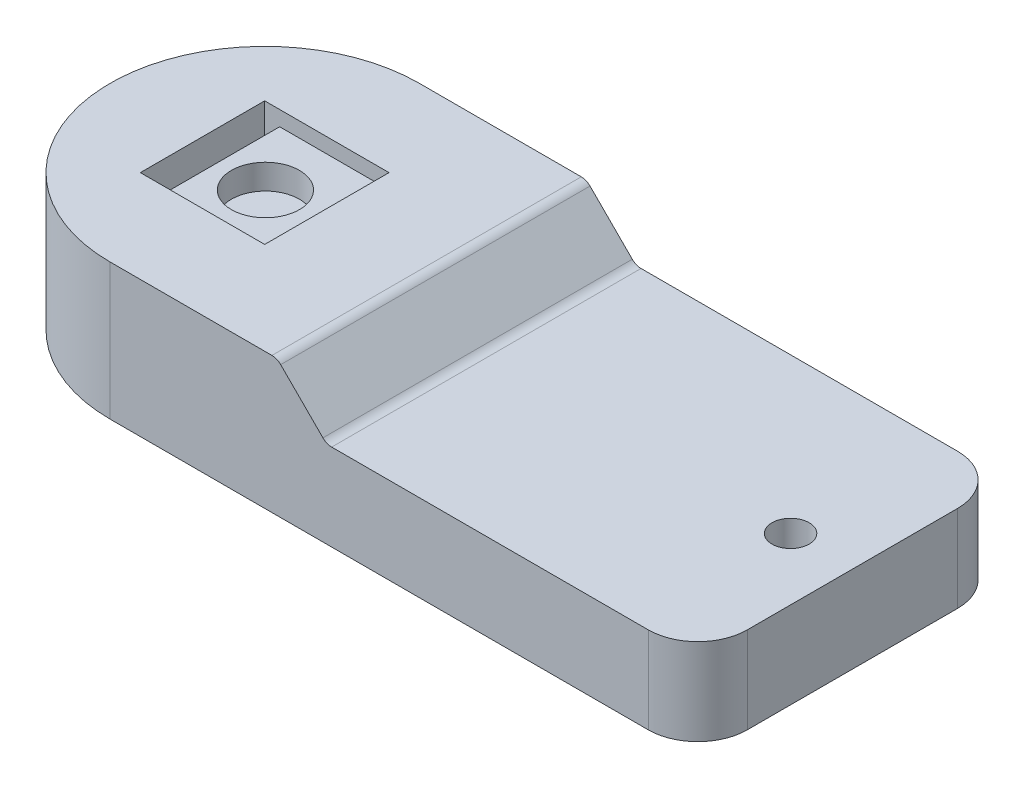
ISO-10303-21;
HEADER;
FILE_DESCRIPTION(('STEP AP214'),'2;1');
FILE_NAME('part.step','',(''),(''),'','','');
FILE_SCHEMA(('AUTOMOTIVE_DESIGN { 1 0 10303 214 1 1 1 1 }'));
ENDSEC;
DATA;
#1=APPLICATION_CONTEXT('core data for automotive mechanical design processes');
#2=APPLICATION_PROTOCOL_DEFINITION('international standard','automotive_design',2000,#1);
#3=PRODUCT_CONTEXT('',#1,'mechanical');
#4=PRODUCT('Part','Part','',(#3));
#5=PRODUCT_RELATED_PRODUCT_CATEGORY('part','',(#4));
#6=PRODUCT_DEFINITION_FORMATION('','',#4);
#7=PRODUCT_DEFINITION_CONTEXT('part definition',#1,'design');
#8=PRODUCT_DEFINITION('design','',#6,#7);
#9=PRODUCT_DEFINITION_SHAPE('','',#8);
#10=(LENGTH_UNIT() NAMED_UNIT(*) SI_UNIT(.MILLI.,.METRE.));
#11=(NAMED_UNIT(*) PLANE_ANGLE_UNIT() SI_UNIT($,.RADIAN.));
#12=(NAMED_UNIT(*) SI_UNIT($,.STERADIAN.) SOLID_ANGLE_UNIT());
#13=UNCERTAINTY_MEASURE_WITH_UNIT(LENGTH_MEASURE(1.E-05),#10,'distance_accuracy_value','');
#14=(GEOMETRIC_REPRESENTATION_CONTEXT(3) GLOBAL_UNCERTAINTY_ASSIGNED_CONTEXT((#13)) GLOBAL_UNIT_ASSIGNED_CONTEXT((#10,
#11,#12)) REPRESENTATION_CONTEXT('',''));
#15=CARTESIAN_POINT('',(0.,0.,0.));
#16=DIRECTION('',(0.,0.,1.));
#17=DIRECTION('',(1.,0.,0.));
#18=AXIS2_PLACEMENT_3D('',#15,#16,#17);
#19=CARTESIAN_POINT('',(-17.5,11.,0.));
#20=DIRECTION('',(0.,-1.,0.));
#21=DIRECTION('',(0.,0.,-1.));
#22=AXIS2_PLACEMENT_3D('',#19,#20,#21);
#23=CYLINDRICAL_SURFACE('',#22,12.5);
#24=DIRECTION('',(0.,-1.,0.));
#25=VECTOR('',#24,1.);
#26=CARTESIAN_POINT('',(-17.5,11.,12.5));
#27=LINE('',#26,#25);
#28=CARTESIAN_POINT('',(-17.5,11.,12.5));
#29=VERTEX_POINT('',#28);
#30=CARTESIAN_POINT('',(-17.5,0.,12.5));
#31=VERTEX_POINT('',#30);
#32=EDGE_CURVE('E252',#29,#31,#27,.T.);
#33=ORIENTED_EDGE('',*,*,#32,.F.);
#34=CARTESIAN_POINT('',(-17.5,11.,0.));
#35=DIRECTION('',(0.,1.,0.));
#36=DIRECTION('',(0.,0.,1.));
#37=AXIS2_PLACEMENT_3D('',#34,#35,#36);
#38=CIRCLE('',#37,12.5);
#39=CARTESIAN_POINT('',(-17.5,11.,-12.5));
#40=VERTEX_POINT('',#39);
#41=EDGE_CURVE('E262',#40,#29,#38,.T.);
#42=ORIENTED_EDGE('',*,*,#41,.F.);
#43=DIRECTION('',(0.,-1.,0.));
#44=VECTOR('',#43,1.);
#45=CARTESIAN_POINT('',(-17.5,11.,-12.5));
#46=LINE('',#45,#44);
#47=CARTESIAN_POINT('',(-17.5,0.,-12.5));
#48=VERTEX_POINT('',#47);
#49=EDGE_CURVE('E259',#48,#40,#46,.F.);
#50=ORIENTED_EDGE('',*,*,#49,.F.);
#51=CARTESIAN_POINT('',(-17.5,0.,0.));
#52=DIRECTION('',(0.,1.,0.));
#53=DIRECTION('',(0.,0.,1.));
#54=AXIS2_PLACEMENT_3D('',#51,#52,#53);
#55=CIRCLE('',#54,12.5);
#56=EDGE_CURVE('E264',#31,#48,#55,.F.);
#57=ORIENTED_EDGE('',*,*,#56,.F.);
#58=EDGE_LOOP('',(#33,#42,#50,#57));
#59=FACE_BOUND('',#58,.T.);
#60=ADVANCED_FACE('F34',(#59),#23,.T.);
#61=CARTESIAN_POINT('',(30.,11.,-12.5));
#62=DIRECTION('',(-1.,0.,0.));
#63=DIRECTION('',(0.,0.,1.));
#64=AXIS2_PLACEMENT_3D('',#61,#62,#63);
#65=PLANE('',#64);
#66=DIRECTION('',(0.,0.,-1.));
#67=VECTOR('',#66,1.);
#68=CARTESIAN_POINT('',(30.,0.,-12.5));
#69=LINE('',#68,#67);
#70=CARTESIAN_POINT('',(30.,0.,8.5));
#71=VERTEX_POINT('',#70);
#72=CARTESIAN_POINT('',(30.,0.,-8.5));
#73=VERTEX_POINT('',#72);
#74=EDGE_CURVE('E254',#71,#73,#69,.T.);
#75=ORIENTED_EDGE('',*,*,#74,.T.);
#76=DIRECTION('',(0.,-1.,0.));
#77=VECTOR('',#76,1.);
#78=CARTESIAN_POINT('',(30.,11.,-8.5));
#79=LINE('',#78,#77);
#80=CARTESIAN_POINT('',(30.,7.,-8.5));
#81=VERTEX_POINT('',#80);
#82=EDGE_CURVE('E55',#73,#81,#79,.F.);
#83=ORIENTED_EDGE('',*,*,#82,.T.);
#84=DIRECTION('',(0.,0.,-1.));
#85=VECTOR('',#84,1.);
#86=CARTESIAN_POINT('',(30.,7.,12.5));
#87=LINE('',#86,#85);
#88=CARTESIAN_POINT('',(30.,7.,8.5));
#89=VERTEX_POINT('',#88);
#90=EDGE_CURVE('E241',#89,#81,#87,.T.);
#91=ORIENTED_EDGE('',*,*,#90,.F.);
#92=DIRECTION('',(0.,-1.,0.));
#93=VECTOR('',#92,1.);
#94=CARTESIAN_POINT('',(30.,11.,8.5));
#95=LINE('',#94,#93);
#96=EDGE_CURVE('E299',#89,#71,#95,.T.);
#97=ORIENTED_EDGE('',*,*,#96,.T.);
#98=EDGE_LOOP('',(#75,#83,#91,#97));
#99=FACE_BOUND('',#98,.T.);
#100=ADVANCED_FACE('F319',(#99),#65,.F.);
#101=CARTESIAN_POINT('',(-30.,11.,12.5));
#102=DIRECTION('',(0.,0.,-1.));
#103=DIRECTION('',(-1.,0.,0.));
#104=AXIS2_PLACEMENT_3D('',#101,#102,#103);
#105=PLANE('',#104);
#106=DIRECTION('',(1.,0.,0.));
#107=VECTOR('',#106,1.);
#108=CARTESIAN_POINT('',(-30.,0.,12.5));
#109=LINE('',#108,#107);
#110=CARTESIAN_POINT('',(26.,0.,12.5));
#111=VERTEX_POINT('',#110);
#112=EDGE_CURVE('E245',#31,#111,#109,.T.);
#113=ORIENTED_EDGE('',*,*,#112,.T.);
#114=DIRECTION('',(0.,-1.,0.));
#115=VECTOR('',#114,1.);
#116=CARTESIAN_POINT('',(26.,11.,12.5));
#117=LINE('',#116,#115);
#118=CARTESIAN_POINT('',(26.,7.,12.5));
#119=VERTEX_POINT('',#118);
#120=EDGE_CURVE('E11',#111,#119,#117,.F.);
#121=ORIENTED_EDGE('',*,*,#120,.T.);
#122=DIRECTION('',(1.,0.,0.));
#123=VECTOR('',#122,1.);
#124=CARTESIAN_POINT('',(0.,7.,12.5));
#125=LINE('',#124,#123);
#126=CARTESIAN_POINT('',(0.41421356237307,7.,12.5));
#127=VERTEX_POINT('',#126);
#128=EDGE_CURVE('E233',#127,#119,#125,.T.);
#129=ORIENTED_EDGE('',*,*,#128,.F.);
#130=CARTESIAN_POINT('',(0.41421356237307,8.,12.5));
#131=DIRECTION('',(0.,0.,-1.));
#132=DIRECTION('',(-1.,0.,0.));
#133=AXIS2_PLACEMENT_3D('',#130,#131,#132);
#134=CIRCLE('',#133,1.);
#135=CARTESIAN_POINT('',(-0.292893218813478,7.29289321881345,12.5));
#136=VERTEX_POINT('',#135);
#137=EDGE_CURVE('E287',#127,#136,#134,.T.);
#138=ORIENTED_EDGE('',*,*,#137,.T.);
#139=DIRECTION('',(-0.707106781186548,0.707106781186548,0.));
#140=VECTOR('',#139,1.);
#141=CARTESIAN_POINT('',(0.,6.99999999999998,12.5));
#142=LINE('',#141,#140);
#143=CARTESIAN_POINT('',(-3.70710678118657,10.7071067811865,12.5));
#144=VERTEX_POINT('',#143);
#145=EDGE_CURVE('E267',#136,#144,#142,.T.);
#146=ORIENTED_EDGE('',*,*,#145,.T.);
#147=CARTESIAN_POINT('',(-4.41421356237312,10.,12.5));
#148=DIRECTION('',(0.,0.,-1.));
#149=DIRECTION('',(-1.,0.,0.));
#150=AXIS2_PLACEMENT_3D('',#147,#148,#149);
#151=CIRCLE('',#150,1.);
#152=CARTESIAN_POINT('',(-4.41421356237312,11.,12.5));
#153=VERTEX_POINT('',#152);
#154=EDGE_CURVE('E285',#144,#153,#151,.F.);
#155=ORIENTED_EDGE('',*,*,#154,.T.);
#156=DIRECTION('',(1.,0.,0.));
#157=VECTOR('',#156,1.);
#158=CARTESIAN_POINT('',(-30.,11.,12.5));
#159=LINE('',#158,#157);
#160=EDGE_CURVE('E246',#29,#153,#159,.T.);
#161=ORIENTED_EDGE('',*,*,#160,.F.);
#162=ORIENTED_EDGE('',*,*,#32,.T.);
#163=EDGE_LOOP('',(#113,#121,#129,#138,#146,#155,#161,#162));
#164=FACE_BOUND('',#163,.T.);
#165=ADVANCED_FACE('F324',(#164),#105,.F.);
#166=CARTESIAN_POINT('',(-30.,11.,-12.5));
#167=DIRECTION('',(0.,0.,1.));
#168=DIRECTION('',(1.,0.,0.));
#169=AXIS2_PLACEMENT_3D('',#166,#167,#168);
#170=PLANE('',#169);
#171=DIRECTION('',(-1.,0.,0.));
#172=VECTOR('',#171,1.);
#173=CARTESIAN_POINT('',(30.,7.,-12.5));
#174=LINE('',#173,#172);
#175=CARTESIAN_POINT('',(26.,7.,-12.5));
#176=VERTEX_POINT('',#175);
#177=CARTESIAN_POINT('',(0.414213562373061,7.,-12.5));
#178=VERTEX_POINT('',#177);
#179=EDGE_CURVE('E243',#176,#178,#174,.T.);
#180=ORIENTED_EDGE('',*,*,#179,.F.);
#181=DIRECTION('',(0.,-1.,0.));
#182=VECTOR('',#181,1.);
#183=CARTESIAN_POINT('',(26.,11.,-12.5));
#184=LINE('',#183,#182);
#185=CARTESIAN_POINT('',(26.,0.,-12.5));
#186=VERTEX_POINT('',#185);
#187=EDGE_CURVE('E292',#176,#186,#184,.T.);
#188=ORIENTED_EDGE('',*,*,#187,.T.);
#189=DIRECTION('',(-1.,0.,0.));
#190=VECTOR('',#189,1.);
#191=CARTESIAN_POINT('',(-30.,0.,-12.5));
#192=LINE('',#191,#190);
#193=EDGE_CURVE('E250',#186,#48,#192,.T.);
#194=ORIENTED_EDGE('',*,*,#193,.T.);
#195=ORIENTED_EDGE('',*,*,#49,.T.);
#196=DIRECTION('',(-1.,0.,0.));
#197=VECTOR('',#196,1.);
#198=CARTESIAN_POINT('',(-30.,11.,-12.5));
#199=LINE('',#198,#197);
#200=CARTESIAN_POINT('',(-4.41421356237313,11.,-12.5));
#201=VERTEX_POINT('',#200);
#202=EDGE_CURVE('E249',#201,#40,#199,.T.);
#203=ORIENTED_EDGE('',*,*,#202,.F.);
#204=CARTESIAN_POINT('',(-4.41421356237313,10.,-12.5));
#205=DIRECTION('',(0.,0.,1.));
#206=DIRECTION('',(1.,0.,0.));
#207=AXIS2_PLACEMENT_3D('',#204,#205,#206);
#208=CIRCLE('',#207,1.);
#209=CARTESIAN_POINT('',(-3.70710678118658,10.7071067811865,-12.5));
#210=VERTEX_POINT('',#209);
#211=EDGE_CURVE('E283',#201,#210,#208,.F.);
#212=ORIENTED_EDGE('',*,*,#211,.T.);
#213=DIRECTION('',(0.707106781186548,-0.707106781186548,0.));
#214=VECTOR('',#213,1.);
#215=CARTESIAN_POINT('',(0.,6.99999999999998,-12.5));
#216=LINE('',#215,#214);
#217=CARTESIAN_POINT('',(-0.292893218813485,7.29289321881345,-12.5));
#218=VERTEX_POINT('',#217);
#219=EDGE_CURVE('E270',#210,#218,#216,.T.);
#220=ORIENTED_EDGE('',*,*,#219,.T.);
#221=CARTESIAN_POINT('',(0.414213562373063,8.,-12.5));
#222=DIRECTION('',(0.,0.,1.));
#223=DIRECTION('',(1.,0.,0.));
#224=AXIS2_PLACEMENT_3D('',#221,#222,#223);
#225=CIRCLE('',#224,1.);
#226=EDGE_CURVE('E289',#218,#178,#225,.T.);
#227=ORIENTED_EDGE('',*,*,#226,.T.);
#228=EDGE_LOOP('',(#180,#188,#194,#195,#203,#212,#220,#227));
#229=FACE_BOUND('',#228,.T.);
#230=ADVANCED_FACE('F311',(#229),#170,.F.);
#231=CARTESIAN_POINT('',(0.,11.,0.));
#232=DIRECTION('',(0.,1.,0.));
#233=DIRECTION('',(0.,0.,1.));
#234=AXIS2_PLACEMENT_3D('',#231,#232,#233);
#235=PLANE('',#234);
#236=DIRECTION('',(0.,0.,1.));
#237=VECTOR('',#236,1.);
#238=CARTESIAN_POINT('',(-22.525,11.,-5.025));
#239=LINE('',#238,#237);
#240=CARTESIAN_POINT('',(-22.525,11.,-5.025));
#241=VERTEX_POINT('',#240);
#242=CARTESIAN_POINT('',(-22.525,11.,5.025));
#243=VERTEX_POINT('',#242);
#244=EDGE_CURVE('E196',#241,#243,#239,.T.);
#245=ORIENTED_EDGE('',*,*,#244,.F.);
#246=DIRECTION('',(-1.,0.,0.));
#247=VECTOR('',#246,1.);
#248=CARTESIAN_POINT('',(-22.525,11.,-5.025));
#249=LINE('',#248,#247);
#250=CARTESIAN_POINT('',(-12.475,11.,-5.025));
#251=VERTEX_POINT('',#250);
#252=EDGE_CURVE('E220',#251,#241,#249,.T.);
#253=ORIENTED_EDGE('',*,*,#252,.F.);
#254=DIRECTION('',(0.,0.,-1.));
#255=VECTOR('',#254,1.);
#256=CARTESIAN_POINT('',(-12.475,11.,-5.025));
#257=LINE('',#256,#255);
#258=CARTESIAN_POINT('',(-12.475,11.,5.025));
#259=VERTEX_POINT('',#258);
#260=EDGE_CURVE('E227',#259,#251,#257,.T.);
#261=ORIENTED_EDGE('',*,*,#260,.F.);
#262=DIRECTION('',(1.,0.,0.));
#263=VECTOR('',#262,1.);
#264=CARTESIAN_POINT('',(-22.525,11.,5.025));
#265=LINE('',#264,#263);
#266=EDGE_CURVE('E224',#243,#259,#265,.T.);
#267=ORIENTED_EDGE('',*,*,#266,.F.);
#268=EDGE_LOOP('',(#245,#253,#261,#267));
#269=FACE_BOUND('',#268,.T.);
#270=ORIENTED_EDGE('',*,*,#160,.T.);
#271=DIRECTION('',(0.,0.,-1.));
#272=VECTOR('',#271,1.);
#273=CARTESIAN_POINT('',(-4.41421356237312,11.,0.));
#274=LINE('',#273,#272);
#275=EDGE_CURVE('E280',#153,#201,#274,.T.);
#276=ORIENTED_EDGE('',*,*,#275,.T.);
#277=ORIENTED_EDGE('',*,*,#202,.T.);
#278=ORIENTED_EDGE('',*,*,#41,.T.);
#279=EDGE_LOOP('',(#270,#276,#277,#278));
#280=FACE_BOUND('',#279,.T.);
#281=ADVANCED_FACE('F333',(#269,#280),#235,.T.);
#282=CARTESIAN_POINT('',(0.,0.,0.));
#283=DIRECTION('',(0.,1.,0.));
#284=DIRECTION('',(0.,0.,1.));
#285=AXIS2_PLACEMENT_3D('',#282,#283,#284);
#286=PLANE('',#285);
#287=CARTESIAN_POINT('',(25.,0.,0.));
#288=DIRECTION('',(0.,1.,0.));
#289=DIRECTION('',(0.,0.,1.));
#290=AXIS2_PLACEMENT_3D('',#287,#288,#289);
#291=CIRCLE('',#290,1.5);
#292=CARTESIAN_POINT('',(25.,0.,1.5));
#293=VERTEX_POINT('',#292);
#294=EDGE_CURVE('E438',#293,#293,#291,.T.);
#295=ORIENTED_EDGE('',*,*,#294,.T.);
#296=EDGE_LOOP('',(#295));
#297=FACE_BOUND('',#296,.T.);
#298=CARTESIAN_POINT('',(-17.5,0.,0.));
#299=DIRECTION('',(0.,-1.,0.));
#300=DIRECTION('',(0.,0.,-1.));
#301=AXIS2_PLACEMENT_3D('',#298,#299,#300);
#302=CIRCLE('',#301,6.96);
#303=CARTESIAN_POINT('',(-17.5,0.,-6.96));
#304=VERTEX_POINT('',#303);
#305=EDGE_CURVE('E449',#304,#304,#302,.T.);
#306=ORIENTED_EDGE('',*,*,#305,.F.);
#307=EDGE_LOOP('',(#306));
#308=FACE_BOUND('',#307,.T.);
#309=ORIENTED_EDGE('',*,*,#193,.F.);
#310=CARTESIAN_POINT('',(26.,0.,-8.5));
#311=DIRECTION('',(0.,1.,0.));
#312=DIRECTION('',(0.,0.,1.));
#313=AXIS2_PLACEMENT_3D('',#310,#311,#312);
#314=CIRCLE('',#313,4.);
#315=EDGE_CURVE('E297',#186,#73,#314,.F.);
#316=ORIENTED_EDGE('',*,*,#315,.T.);
#317=ORIENTED_EDGE('',*,*,#74,.F.);
#318=CARTESIAN_POINT('',(26.,0.,8.5));
#319=DIRECTION('',(0.,1.,0.));
#320=DIRECTION('',(0.,0.,1.));
#321=AXIS2_PLACEMENT_3D('',#318,#319,#320);
#322=CIRCLE('',#321,4.);
#323=EDGE_CURVE('E295',#71,#111,#322,.F.);
#324=ORIENTED_EDGE('',*,*,#323,.T.);
#325=ORIENTED_EDGE('',*,*,#112,.F.);
#326=ORIENTED_EDGE('',*,*,#56,.T.);
#327=EDGE_LOOP('',(#309,#316,#317,#324,#325,#326));
#328=FACE_BOUND('',#327,.T.);
#329=ADVANCED_FACE('F318',(#297,#308,#328),#286,.F.);
#330=CARTESIAN_POINT('',(0.,7.,0.));
#331=DIRECTION('',(0.,1.,0.));
#332=DIRECTION('',(0.,0.,1.));
#333=AXIS2_PLACEMENT_3D('',#330,#331,#332);
#334=PLANE('',#333);
#335=CARTESIAN_POINT('',(25.,7.,0.));
#336=DIRECTION('',(0.,1.,0.));
#337=DIRECTION('',(0.,0.,1.));
#338=AXIS2_PLACEMENT_3D('',#335,#336,#337);
#339=CIRCLE('',#338,1.5);
#340=CARTESIAN_POINT('',(25.,7.,1.5));
#341=VERTEX_POINT('',#340);
#342=EDGE_CURVE('E441',#341,#341,#339,.T.);
#343=ORIENTED_EDGE('',*,*,#342,.F.);
#344=EDGE_LOOP('',(#343));
#345=FACE_BOUND('',#344,.T.);
#346=ORIENTED_EDGE('',*,*,#90,.T.);
#347=CARTESIAN_POINT('',(26.,7.,-8.5));
#348=DIRECTION('',(0.,1.,0.));
#349=DIRECTION('',(0.,0.,1.));
#350=AXIS2_PLACEMENT_3D('',#347,#348,#349);
#351=CIRCLE('',#350,4.);
#352=EDGE_CURVE('E42',#81,#176,#351,.T.);
#353=ORIENTED_EDGE('',*,*,#352,.T.);
#354=ORIENTED_EDGE('',*,*,#179,.T.);
#355=DIRECTION('',(0.,0.,1.));
#356=VECTOR('',#355,1.);
#357=CARTESIAN_POINT('',(0.41421356237307,7.,12.5));
#358=LINE('',#357,#356);
#359=EDGE_CURVE('E273',#178,#127,#358,.T.);
#360=ORIENTED_EDGE('',*,*,#359,.T.);
#361=ORIENTED_EDGE('',*,*,#128,.T.);
#362=CARTESIAN_POINT('',(26.,7.,8.5));
#363=DIRECTION('',(0.,1.,0.));
#364=DIRECTION('',(0.,0.,1.));
#365=AXIS2_PLACEMENT_3D('',#362,#363,#364);
#366=CIRCLE('',#365,4.);
#367=EDGE_CURVE('E303',#119,#89,#366,.T.);
#368=ORIENTED_EDGE('',*,*,#367,.T.);
#369=EDGE_LOOP('',(#346,#353,#354,#360,#361,#368));
#370=FACE_BOUND('',#369,.T.);
#371=ADVANCED_FACE('F307',(#345,#370),#334,.T.);
#372=CARTESIAN_POINT('',(-22.525,9.79,-5.025));
#373=DIRECTION('',(-1.,0.,0.));
#374=DIRECTION('',(0.,0.,1.));
#375=AXIS2_PLACEMENT_3D('',#372,#373,#374);
#376=PLANE('',#375);
#377=ORIENTED_EDGE('',*,*,#244,.T.);
#378=DIRECTION('',(0.,1.,0.));
#379=VECTOR('',#378,1.);
#380=CARTESIAN_POINT('',(-22.525,9.79,5.025));
#381=LINE('',#380,#379);
#382=CARTESIAN_POINT('',(-22.525,7.77,5.025));
#383=VERTEX_POINT('',#382);
#384=EDGE_CURVE('E222',#383,#243,#381,.T.);
#385=ORIENTED_EDGE('',*,*,#384,.F.);
#386=DIRECTION('',(0.,0.,1.));
#387=VECTOR('',#386,1.);
#388=CARTESIAN_POINT('',(-22.525,7.77,5.025));
#389=LINE('',#388,#387);
#390=CARTESIAN_POINT('',(-22.525,7.77,-5.025));
#391=VERTEX_POINT('',#390);
#392=EDGE_CURVE('E198',#391,#383,#389,.T.);
#393=ORIENTED_EDGE('',*,*,#392,.F.);
#394=DIRECTION('',(0.,1.,0.));
#395=VECTOR('',#394,1.);
#396=CARTESIAN_POINT('',(-22.525,9.79,-5.025));
#397=LINE('',#396,#395);
#398=EDGE_CURVE('E231',#391,#241,#397,.T.);
#399=ORIENTED_EDGE('',*,*,#398,.T.);
#400=EDGE_LOOP('',(#377,#385,#393,#399));
#401=FACE_BOUND('',#400,.T.);
#402=ADVANCED_FACE('F376',(#401),#376,.F.);
#403=CARTESIAN_POINT('',(-22.525,9.79,-5.025));
#404=DIRECTION('',(0.,0.,-1.));
#405=DIRECTION('',(-1.,0.,0.));
#406=AXIS2_PLACEMENT_3D('',#403,#404,#405);
#407=PLANE('',#406);
#408=ORIENTED_EDGE('',*,*,#252,.T.);
#409=ORIENTED_EDGE('',*,*,#398,.F.);
#410=DIRECTION('',(-1.,0.,0.));
#411=VECTOR('',#410,1.);
#412=CARTESIAN_POINT('',(-22.525,7.77,-5.025));
#413=LINE('',#412,#411);
#414=CARTESIAN_POINT('',(-21.315,7.77,-5.025));
#415=VERTEX_POINT('',#414);
#416=EDGE_CURVE('E208',#415,#391,#413,.T.);
#417=ORIENTED_EDGE('',*,*,#416,.F.);
#418=DIRECTION('',(0.,1.,0.));
#419=VECTOR('',#418,1.);
#420=CARTESIAN_POINT('',(-21.315,7.77,-5.025));
#421=LINE('',#420,#419);
#422=CARTESIAN_POINT('',(-21.315,9.79,-5.025));
#423=VERTEX_POINT('',#422);
#424=EDGE_CURVE('E188',#415,#423,#421,.T.);
#425=ORIENTED_EDGE('',*,*,#424,.T.);
#426=DIRECTION('',(-1.,0.,0.));
#427=VECTOR('',#426,1.);
#428=CARTESIAN_POINT('',(-22.525,9.79,-5.025));
#429=LINE('',#428,#427);
#430=CARTESIAN_POINT('',(-13.685,9.79,-5.025));
#431=VERTEX_POINT('',#430);
#432=EDGE_CURVE('E169',#431,#423,#429,.T.);
#433=ORIENTED_EDGE('',*,*,#432,.F.);
#434=DIRECTION('',(0.,1.,0.));
#435=VECTOR('',#434,1.);
#436=CARTESIAN_POINT('',(-13.685,7.77,-5.025));
#437=LINE('',#436,#435);
#438=CARTESIAN_POINT('',(-13.685,7.77,-5.025));
#439=VERTEX_POINT('',#438);
#440=EDGE_CURVE('E161',#439,#431,#437,.T.);
#441=ORIENTED_EDGE('',*,*,#440,.F.);
#442=DIRECTION('',(-1.,0.,0.));
#443=VECTOR('',#442,1.);
#444=CARTESIAN_POINT('',(-12.475,7.77,-5.025));
#445=LINE('',#444,#443);
#446=CARTESIAN_POINT('',(-12.475,7.77,-5.025));
#447=VERTEX_POINT('',#446);
#448=EDGE_CURVE('E166',#447,#439,#445,.T.);
#449=ORIENTED_EDGE('',*,*,#448,.F.);
#450=DIRECTION('',(0.,1.,0.));
#451=VECTOR('',#450,1.);
#452=CARTESIAN_POINT('',(-12.475,9.79,-5.025));
#453=LINE('',#452,#451);
#454=EDGE_CURVE('E234',#447,#251,#453,.T.);
#455=ORIENTED_EDGE('',*,*,#454,.T.);
#456=EDGE_LOOP('',(#408,#409,#417,#425,#433,#441,#449,#455));
#457=FACE_BOUND('',#456,.T.);
#458=ADVANCED_FACE('F164',(#457),#407,.F.);
#459=CARTESIAN_POINT('',(-12.475,9.79,-5.025));
#460=DIRECTION('',(1.,0.,0.));
#461=DIRECTION('',(0.,0.,-1.));
#462=AXIS2_PLACEMENT_3D('',#459,#460,#461);
#463=PLANE('',#462);
#464=ORIENTED_EDGE('',*,*,#260,.T.);
#465=ORIENTED_EDGE('',*,*,#454,.F.);
#466=DIRECTION('',(0.,0.,-1.));
#467=VECTOR('',#466,1.);
#468=CARTESIAN_POINT('',(-12.475,7.77,5.025));
#469=LINE('',#468,#467);
#470=CARTESIAN_POINT('',(-12.475,7.77,5.025));
#471=VERTEX_POINT('',#470);
#472=EDGE_CURVE('E174',#471,#447,#469,.T.);
#473=ORIENTED_EDGE('',*,*,#472,.F.);
#474=DIRECTION('',(0.,1.,0.));
#475=VECTOR('',#474,1.);
#476=CARTESIAN_POINT('',(-12.475,9.79,5.025));
#477=LINE('',#476,#475);
#478=EDGE_CURVE('E236',#471,#259,#477,.T.);
#479=ORIENTED_EDGE('',*,*,#478,.T.);
#480=EDGE_LOOP('',(#464,#465,#473,#479));
#481=FACE_BOUND('',#480,.T.);
#482=ADVANCED_FACE('F385',(#481),#463,.F.);
#483=CARTESIAN_POINT('',(-22.525,9.79,5.025));
#484=DIRECTION('',(0.,0.,1.));
#485=DIRECTION('',(1.,0.,0.));
#486=AXIS2_PLACEMENT_3D('',#483,#484,#485);
#487=PLANE('',#486);
#488=ORIENTED_EDGE('',*,*,#266,.T.);
#489=ORIENTED_EDGE('',*,*,#478,.F.);
#490=DIRECTION('',(1.,0.,0.));
#491=VECTOR('',#490,1.);
#492=CARTESIAN_POINT('',(-13.685,7.77,5.025));
#493=LINE('',#492,#491);
#494=CARTESIAN_POINT('',(-13.685,7.77,5.025));
#495=VERTEX_POINT('',#494);
#496=EDGE_CURVE('E182',#495,#471,#493,.T.);
#497=ORIENTED_EDGE('',*,*,#496,.F.);
#498=DIRECTION('',(0.,1.,0.));
#499=VECTOR('',#498,1.);
#500=CARTESIAN_POINT('',(-13.685,7.77,5.025));
#501=LINE('',#500,#499);
#502=CARTESIAN_POINT('',(-13.685,9.79,5.025));
#503=VERTEX_POINT('',#502);
#504=EDGE_CURVE('E173',#495,#503,#501,.T.);
#505=ORIENTED_EDGE('',*,*,#504,.T.);
#506=DIRECTION('',(1.,0.,0.));
#507=VECTOR('',#506,1.);
#508=CARTESIAN_POINT('',(-22.525,9.79,5.025));
#509=LINE('',#508,#507);
#510=CARTESIAN_POINT('',(-21.315,9.79,5.025));
#511=VERTEX_POINT('',#510);
#512=EDGE_CURVE('E217',#511,#503,#509,.T.);
#513=ORIENTED_EDGE('',*,*,#512,.F.);
#514=DIRECTION('',(0.,1.,0.));
#515=VECTOR('',#514,1.);
#516=CARTESIAN_POINT('',(-21.315,7.77,5.025));
#517=LINE('',#516,#515);
#518=CARTESIAN_POINT('',(-21.315,7.77,5.025));
#519=VERTEX_POINT('',#518);
#520=EDGE_CURVE('E211',#519,#511,#517,.T.);
#521=ORIENTED_EDGE('',*,*,#520,.F.);
#522=DIRECTION('',(1.,0.,0.));
#523=VECTOR('',#522,1.);
#524=CARTESIAN_POINT('',(-21.315,7.77,5.025));
#525=LINE('',#524,#523);
#526=EDGE_CURVE('E201',#383,#519,#525,.T.);
#527=ORIENTED_EDGE('',*,*,#526,.F.);
#528=ORIENTED_EDGE('',*,*,#384,.T.);
#529=EDGE_LOOP('',(#488,#489,#497,#505,#513,#521,#527,#528));
#530=FACE_BOUND('',#529,.T.);
#531=ADVANCED_FACE('F381',(#530),#487,.F.);
#532=CARTESIAN_POINT('',(0.,9.79,0.));
#533=DIRECTION('',(0.,1.,0.));
#534=DIRECTION('',(0.,0.,1.));
#535=AXIS2_PLACEMENT_3D('',#532,#533,#534);
#536=PLANE('',#535);
#537=CARTESIAN_POINT('',(-17.465,9.79,-0.0250000000000007));
#538=DIRECTION('',(0.,1.,0.));
#539=DIRECTION('',(0.,0.,1.));
#540=AXIS2_PLACEMENT_3D('',#537,#538,#539);
#541=CIRCLE('',#540,2.75);
#542=CARTESIAN_POINT('',(-17.465,9.79,2.725));
#543=VERTEX_POINT('',#542);
#544=EDGE_CURVE('E191',#543,#543,#541,.T.);
#545=ORIENTED_EDGE('',*,*,#544,.F.);
#546=EDGE_LOOP('',(#545));
#547=FACE_BOUND('',#546,.T.);
#548=DIRECTION('',(0.,0.,1.));
#549=VECTOR('',#548,1.);
#550=CARTESIAN_POINT('',(-13.685,9.79,-5.025));
#551=LINE('',#550,#549);
#552=EDGE_CURVE('E186',#431,#503,#551,.T.);
#553=ORIENTED_EDGE('',*,*,#552,.F.);
#554=ORIENTED_EDGE('',*,*,#432,.T.);
#555=DIRECTION('',(0.,0.,-1.));
#556=VECTOR('',#555,1.);
#557=CARTESIAN_POINT('',(-21.315,9.79,-5.025));
#558=LINE('',#557,#556);
#559=EDGE_CURVE('E202',#511,#423,#558,.T.);
#560=ORIENTED_EDGE('',*,*,#559,.F.);
#561=ORIENTED_EDGE('',*,*,#512,.T.);
#562=EDGE_LOOP('',(#553,#554,#560,#561));
#563=FACE_BOUND('',#562,.T.);
#564=ADVANCED_FACE('F384',(#547,#563),#536,.T.);
#565=CARTESIAN_POINT('',(-21.315,7.77,-5.025));
#566=DIRECTION('',(1.,0.,0.));
#567=DIRECTION('',(0.,0.,-1.));
#568=AXIS2_PLACEMENT_3D('',#565,#566,#567);
#569=PLANE('',#568);
#570=ORIENTED_EDGE('',*,*,#559,.T.);
#571=ORIENTED_EDGE('',*,*,#424,.F.);
#572=DIRECTION('',(0.,0.,-1.));
#573=VECTOR('',#572,1.);
#574=CARTESIAN_POINT('',(-21.315,7.77,-5.025));
#575=LINE('',#574,#573);
#576=EDGE_CURVE('E205',#519,#415,#575,.T.);
#577=ORIENTED_EDGE('',*,*,#576,.F.);
#578=ORIENTED_EDGE('',*,*,#520,.T.);
#579=EDGE_LOOP('',(#570,#571,#577,#578));
#580=FACE_BOUND('',#579,.T.);
#581=ADVANCED_FACE('F394',(#580),#569,.F.);
#582=CARTESIAN_POINT('',(0.,7.77,0.));
#583=DIRECTION('',(0.,-1.,0.));
#584=DIRECTION('',(0.,0.,-1.));
#585=AXIS2_PLACEMENT_3D('',#582,#583,#584);
#586=PLANE('',#585);
#587=ORIENTED_EDGE('',*,*,#392,.T.);
#588=ORIENTED_EDGE('',*,*,#526,.T.);
#589=ORIENTED_EDGE('',*,*,#576,.T.);
#590=ORIENTED_EDGE('',*,*,#416,.T.);
#591=EDGE_LOOP('',(#587,#588,#589,#590));
#592=FACE_BOUND('',#591,.T.);
#593=ADVANCED_FACE('F398',(#592),#586,.F.);
#594=CARTESIAN_POINT('',(-13.685,7.77,-5.025));
#595=DIRECTION('',(-1.,0.,0.));
#596=DIRECTION('',(0.,0.,1.));
#597=AXIS2_PLACEMENT_3D('',#594,#595,#596);
#598=PLANE('',#597);
#599=ORIENTED_EDGE('',*,*,#552,.T.);
#600=ORIENTED_EDGE('',*,*,#504,.F.);
#601=DIRECTION('',(0.,0.,1.));
#602=VECTOR('',#601,1.);
#603=CARTESIAN_POINT('',(-13.685,7.77,-5.025));
#604=LINE('',#603,#602);
#605=EDGE_CURVE('E177',#439,#495,#604,.T.);
#606=ORIENTED_EDGE('',*,*,#605,.F.);
#607=ORIENTED_EDGE('',*,*,#440,.T.);
#608=EDGE_LOOP('',(#599,#600,#606,#607));
#609=FACE_BOUND('',#608,.T.);
#610=ADVANCED_FACE('F178',(#609),#598,.F.);
#611=CARTESIAN_POINT('',(0.,7.77,0.));
#612=DIRECTION('',(0.,1.,0.));
#613=DIRECTION('',(0.,0.,1.));
#614=AXIS2_PLACEMENT_3D('',#611,#612,#613);
#615=PLANE('',#614);
#616=ORIENTED_EDGE('',*,*,#448,.T.);
#617=ORIENTED_EDGE('',*,*,#605,.T.);
#618=ORIENTED_EDGE('',*,*,#496,.T.);
#619=ORIENTED_EDGE('',*,*,#472,.T.);
#620=EDGE_LOOP('',(#616,#617,#618,#619));
#621=FACE_BOUND('',#620,.T.);
#622=ADVANCED_FACE('F184',(#621),#615,.T.);
#623=CARTESIAN_POINT('',(-17.465,7.77,-0.0250000000000007));
#624=DIRECTION('',(0.,1.,0.));
#625=DIRECTION('',(0.,0.,1.));
#626=AXIS2_PLACEMENT_3D('',#623,#624,#625);
#627=CYLINDRICAL_SURFACE('',#626,2.75);
#628=CARTESIAN_POINT('',(-17.465,7.77,-0.0250000000000007));
#629=DIRECTION('',(0.,1.,0.));
#630=DIRECTION('',(0.,0.,1.));
#631=AXIS2_PLACEMENT_3D('',#628,#629,#630);
#632=CIRCLE('',#631,2.75);
#633=CARTESIAN_POINT('',(-17.465,7.77,2.725));
#634=VERTEX_POINT('',#633);
#635=EDGE_CURVE('E214',#634,#634,#632,.T.);
#636=ORIENTED_EDGE('',*,*,#635,.F.);
#637=EDGE_LOOP('',(#636));
#638=FACE_BOUND('',#637,.T.);
#639=ORIENTED_EDGE('',*,*,#544,.T.);
#640=EDGE_LOOP('',(#639));
#641=FACE_BOUND('',#640,.T.);
#642=ADVANCED_FACE('F407',(#638,#641),#627,.F.);
#643=CARTESIAN_POINT('',(-17.465,7.77,-0.0250000000000007));
#644=DIRECTION('',(0.,1.,0.));
#645=DIRECTION('',(0.,0.,1.));
#646=AXIS2_PLACEMENT_3D('',#643,#644,#645);
#647=PLANE('',#646);
#648=ORIENTED_EDGE('',*,*,#635,.T.);
#649=EDGE_LOOP('',(#648));
#650=FACE_BOUND('',#649,.T.);
#651=ADVANCED_FACE('F352',(#650),#647,.T.);
#652=CARTESIAN_POINT('',(0.,6.99999999999998,-12.5));
#653=DIRECTION('',(0.707106781186548,0.707106781186548,0.));
#654=DIRECTION('',(0.,0.,-1.));
#655=AXIS2_PLACEMENT_3D('',#652,#653,#654);
#656=PLANE('',#655);
#657=ORIENTED_EDGE('',*,*,#145,.F.);
#658=DIRECTION('',(0.,0.,1.));
#659=VECTOR('',#658,1.);
#660=CARTESIAN_POINT('',(-0.292893218813485,7.29289321881345,-12.5));
#661=LINE('',#660,#659);
#662=EDGE_CURVE('E278',#136,#218,#661,.F.);
#663=ORIENTED_EDGE('',*,*,#662,.T.);
#664=ORIENTED_EDGE('',*,*,#219,.F.);
#665=DIRECTION('',(0.,0.,-1.));
#666=VECTOR('',#665,1.);
#667=CARTESIAN_POINT('',(-3.70710678118658,10.7071067811865,-12.5));
#668=LINE('',#667,#666);
#669=EDGE_CURVE('E276',#210,#144,#668,.F.);
#670=ORIENTED_EDGE('',*,*,#669,.T.);
#671=EDGE_LOOP('',(#657,#663,#664,#670));
#672=FACE_BOUND('',#671,.T.);
#673=ADVANCED_FACE('F341',(#672),#656,.T.);
#674=CARTESIAN_POINT('',(0.414213562373067,8.,0.));
#675=DIRECTION('',(0.,0.,-1.));
#676=DIRECTION('',(-1.,0.,0.));
#677=AXIS2_PLACEMENT_3D('',#674,#675,#676);
#678=CYLINDRICAL_SURFACE('',#677,1.);
#679=ORIENTED_EDGE('',*,*,#226,.F.);
#680=ORIENTED_EDGE('',*,*,#662,.F.);
#681=ORIENTED_EDGE('',*,*,#137,.F.);
#682=ORIENTED_EDGE('',*,*,#359,.F.);
#683=EDGE_LOOP('',(#679,#680,#681,#682));
#684=FACE_BOUND('',#683,.T.);
#685=ADVANCED_FACE('F344',(#684),#678,.F.);
#686=CARTESIAN_POINT('',(-4.41421356237312,10.,0.));
#687=DIRECTION('',(0.,0.,-1.));
#688=DIRECTION('',(-1.,0.,0.));
#689=AXIS2_PLACEMENT_3D('',#686,#687,#688);
#690=CYLINDRICAL_SURFACE('',#689,1.);
#691=ORIENTED_EDGE('',*,*,#154,.F.);
#692=ORIENTED_EDGE('',*,*,#669,.F.);
#693=ORIENTED_EDGE('',*,*,#211,.F.);
#694=ORIENTED_EDGE('',*,*,#275,.F.);
#695=EDGE_LOOP('',(#691,#692,#693,#694));
#696=FACE_BOUND('',#695,.T.);
#697=ADVANCED_FACE('F337',(#696),#690,.T.);
#698=CARTESIAN_POINT('',(26.,11.,-8.5));
#699=DIRECTION('',(0.,-1.,0.));
#700=DIRECTION('',(0.,0.,-1.));
#701=AXIS2_PLACEMENT_3D('',#698,#699,#700);
#702=CYLINDRICAL_SURFACE('',#701,4.);
#703=ORIENTED_EDGE('',*,*,#352,.F.);
#704=ORIENTED_EDGE('',*,*,#82,.F.);
#705=ORIENTED_EDGE('',*,*,#315,.F.);
#706=ORIENTED_EDGE('',*,*,#187,.F.);
#707=EDGE_LOOP('',(#703,#704,#705,#706));
#708=FACE_BOUND('',#707,.T.);
#709=ADVANCED_FACE('F315',(#708),#702,.T.);
#710=CARTESIAN_POINT('',(26.,11.,8.5));
#711=DIRECTION('',(0.,-1.,0.));
#712=DIRECTION('',(0.,0.,-1.));
#713=AXIS2_PLACEMENT_3D('',#710,#711,#712);
#714=CYLINDRICAL_SURFACE('',#713,4.);
#715=ORIENTED_EDGE('',*,*,#367,.F.);
#716=ORIENTED_EDGE('',*,*,#120,.F.);
#717=ORIENTED_EDGE('',*,*,#323,.F.);
#718=ORIENTED_EDGE('',*,*,#96,.F.);
#719=EDGE_LOOP('',(#715,#716,#717,#718));
#720=FACE_BOUND('',#719,.T.);
#721=ADVANCED_FACE('F36',(#720),#714,.T.);
#722=CARTESIAN_POINT('',(-17.5,1.1,0.));
#723=DIRECTION('',(0.,-1.,0.));
#724=DIRECTION('',(0.,0.,-1.));
#725=AXIS2_PLACEMENT_3D('',#722,#723,#724);
#726=CYLINDRICAL_SURFACE('',#725,6.96);
#727=CARTESIAN_POINT('',(-17.5,1.1,0.));
#728=DIRECTION('',(0.,-1.,0.));
#729=DIRECTION('',(0.,0.,-1.));
#730=AXIS2_PLACEMENT_3D('',#727,#728,#729);
#731=CIRCLE('',#730,6.96);
#732=CARTESIAN_POINT('',(-17.5,1.1,-6.96));
#733=VERTEX_POINT('',#732);
#734=EDGE_CURVE('E452',#733,#733,#731,.T.);
#735=ORIENTED_EDGE('',*,*,#734,.F.);
#736=EDGE_LOOP('',(#735));
#737=FACE_BOUND('',#736,.T.);
#738=ORIENTED_EDGE('',*,*,#305,.T.);
#739=EDGE_LOOP('',(#738));
#740=FACE_BOUND('',#739,.T.);
#741=ADVANCED_FACE('F414',(#737,#740),#726,.F.);
#742=CARTESIAN_POINT('',(-17.5,1.1,0.));
#743=DIRECTION('',(0.,-1.,0.));
#744=DIRECTION('',(0.,0.,-1.));
#745=AXIS2_PLACEMENT_3D('',#742,#743,#744);
#746=PLANE('',#745);
#747=CARTESIAN_POINT('',(-17.5,1.1,0.));
#748=DIRECTION('',(0.,-1.,0.));
#749=DIRECTION('',(0.,0.,-1.));
#750=AXIS2_PLACEMENT_3D('',#747,#748,#749);
#751=CIRCLE('',#750,6.4);
#752=CARTESIAN_POINT('',(-17.5,1.1,-6.4));
#753=VERTEX_POINT('',#752);
#754=EDGE_CURVE('E443',#753,#753,#751,.T.);
#755=ORIENTED_EDGE('',*,*,#754,.F.);
#756=EDGE_LOOP('',(#755));
#757=FACE_BOUND('',#756,.T.);
#758=ORIENTED_EDGE('',*,*,#734,.T.);
#759=EDGE_LOOP('',(#758));
#760=FACE_BOUND('',#759,.T.);
#761=ADVANCED_FACE('F417',(#757,#760),#746,.T.);
#762=CARTESIAN_POINT('',(-17.5,4.7,0.));
#763=DIRECTION('',(0.,-1.,0.));
#764=DIRECTION('',(0.,0.,-1.));
#765=AXIS2_PLACEMENT_3D('',#762,#763,#764);
#766=CYLINDRICAL_SURFACE('',#765,6.4);
#767=CARTESIAN_POINT('',(-17.5,4.7,0.));
#768=DIRECTION('',(0.,-1.,0.));
#769=DIRECTION('',(0.,0.,-1.));
#770=AXIS2_PLACEMENT_3D('',#767,#768,#769);
#771=CIRCLE('',#770,6.4);
#772=CARTESIAN_POINT('',(-17.5,4.7,-6.4));
#773=VERTEX_POINT('',#772);
#774=EDGE_CURVE('E446',#773,#773,#771,.T.);
#775=ORIENTED_EDGE('',*,*,#774,.F.);
#776=EDGE_LOOP('',(#775));
#777=FACE_BOUND('',#776,.T.);
#778=ORIENTED_EDGE('',*,*,#754,.T.);
#779=EDGE_LOOP('',(#778));
#780=FACE_BOUND('',#779,.T.);
#781=ADVANCED_FACE('F421',(#777,#780),#766,.F.);
#782=CARTESIAN_POINT('',(-17.5,4.7,0.));
#783=DIRECTION('',(0.,-1.,0.));
#784=DIRECTION('',(0.,0.,-1.));
#785=AXIS2_PLACEMENT_3D('',#782,#783,#784);
#786=PLANE('',#785);
#787=ORIENTED_EDGE('',*,*,#774,.T.);
#788=EDGE_LOOP('',(#787));
#789=FACE_BOUND('',#788,.T.);
#790=ADVANCED_FACE('F425',(#789),#786,.T.);
#791=CARTESIAN_POINT('',(25.,0.,0.));
#792=DIRECTION('',(0.,1.,0.));
#793=DIRECTION('',(0.,0.,1.));
#794=AXIS2_PLACEMENT_3D('',#791,#792,#793);
#795=CYLINDRICAL_SURFACE('',#794,1.5);
#796=CARTESIAN_POINT('',(25.,0.,1.5));
#797=CARTESIAN_POINT('',(25.,0.0729166666666667,1.5));
#798=CARTESIAN_POINT('',(25.,0.145833333333333,1.5));
#799=CARTESIAN_POINT('',(25.,0.291666666666667,1.5));
#800=CARTESIAN_POINT('',(25.,0.364583333333333,1.5));
#801=CARTESIAN_POINT('',(25.,0.510416666666667,1.5));
#802=CARTESIAN_POINT('',(25.,0.583333333333333,1.5));
#803=CARTESIAN_POINT('',(25.,0.729166666666667,1.5));
#804=CARTESIAN_POINT('',(25.,0.802083333333333,1.5));
#805=CARTESIAN_POINT('',(25.,0.947916666666666,1.5));
#806=CARTESIAN_POINT('',(25.,1.02083333333333,1.5));
#807=CARTESIAN_POINT('',(25.,1.16666666666667,1.5));
#808=CARTESIAN_POINT('',(25.,1.23958333333333,1.5));
#809=CARTESIAN_POINT('',(25.,1.38541666666667,1.5));
#810=CARTESIAN_POINT('',(25.,1.45833333333333,1.5));
#811=CARTESIAN_POINT('',(25.,1.60416666666667,1.5));
#812=CARTESIAN_POINT('',(25.,1.67708333333333,1.5));
#813=CARTESIAN_POINT('',(25.,1.82291666666667,1.5));
#814=CARTESIAN_POINT('',(25.,1.89583333333333,1.5));
#815=CARTESIAN_POINT('',(25.,2.04166666666667,1.5));
#816=CARTESIAN_POINT('',(25.,2.11458333333333,1.5));
#817=CARTESIAN_POINT('',(25.,2.26041666666667,1.5));
#818=CARTESIAN_POINT('',(25.,2.33333333333333,1.5));
#819=CARTESIAN_POINT('',(25.,2.47916666666667,1.5));
#820=CARTESIAN_POINT('',(25.,2.55208333333333,1.5));
#821=CARTESIAN_POINT('',(25.,2.69791666666667,1.5));
#822=CARTESIAN_POINT('',(25.,2.77083333333333,1.5));
#823=CARTESIAN_POINT('',(25.,2.91666666666667,1.5));
#824=CARTESIAN_POINT('',(25.,2.98958333333333,1.5));
#825=CARTESIAN_POINT('',(25.,3.13541666666667,1.5));
#826=CARTESIAN_POINT('',(25.,3.20833333333333,1.5));
#827=CARTESIAN_POINT('',(25.,3.35416666666667,1.5));
#828=CARTESIAN_POINT('',(25.,3.42708333333333,1.5));
#829=CARTESIAN_POINT('',(25.,3.57291666666667,1.5));
#830=CARTESIAN_POINT('',(25.,3.64583333333333,1.5));
#831=CARTESIAN_POINT('',(25.,3.79166666666667,1.5));
#832=CARTESIAN_POINT('',(25.,3.86458333333333,1.5));
#833=CARTESIAN_POINT('',(25.,4.01041666666667,1.5));
#834=CARTESIAN_POINT('',(25.,4.08333333333333,1.5));
#835=CARTESIAN_POINT('',(25.,4.22916666666667,1.5));
#836=CARTESIAN_POINT('',(25.,4.30208333333333,1.5));
#837=CARTESIAN_POINT('',(25.,4.44791666666667,1.5));
#838=CARTESIAN_POINT('',(25.,4.52083333333333,1.5));
#839=CARTESIAN_POINT('',(25.,4.66666666666667,1.5));
#840=CARTESIAN_POINT('',(25.,4.73958333333333,1.5));
#841=CARTESIAN_POINT('',(25.,4.88541666666666,1.5));
#842=CARTESIAN_POINT('',(25.,4.95833333333333,1.5));
#843=CARTESIAN_POINT('',(25.,5.10416666666667,1.5));
#844=CARTESIAN_POINT('',(25.,5.17708333333333,1.5));
#845=CARTESIAN_POINT('',(25.,5.32291666666667,1.5));
#846=CARTESIAN_POINT('',(25.,5.39583333333333,1.5));
#847=CARTESIAN_POINT('',(25.,5.54166666666667,1.5));
#848=CARTESIAN_POINT('',(25.,5.61458333333333,1.5));
#849=CARTESIAN_POINT('',(25.,5.76041666666667,1.5));
#850=CARTESIAN_POINT('',(25.,5.83333333333333,1.5));
#851=CARTESIAN_POINT('',(25.,5.97916666666667,1.5));
#852=CARTESIAN_POINT('',(25.,6.05208333333333,1.5));
#853=CARTESIAN_POINT('',(25.,6.19791666666667,1.5));
#854=CARTESIAN_POINT('',(25.,6.27083333333333,1.5));
#855=CARTESIAN_POINT('',(25.,6.41666666666667,1.5));
#856=CARTESIAN_POINT('',(25.,6.48958333333333,1.5));
#857=CARTESIAN_POINT('',(25.,6.63541666666666,1.5));
#858=CARTESIAN_POINT('',(25.,6.70833333333333,1.5));
#859=CARTESIAN_POINT('',(25.,6.85416666666666,1.5));
#860=CARTESIAN_POINT('',(25.,6.92708333333333,1.5));
#861=CARTESIAN_POINT('',(25.,7.,1.5));
#862=B_SPLINE_CURVE_WITH_KNOTS('',3,(#796,#797,#798,#799,#800,#801,#802,#803,#804,#805,#806,
#807,#808,#809,#810,#811,#812,#813,#814,#815,#816,#817,#818,#819,#820,#821,#822,#823,#824,#825,
#826,#827,#828,#829,#830,#831,#832,#833,#834,#835,#836,#837,#838,#839,#840,#841,#842,#843,#844,
#845,#846,#847,#848,#849,#850,#851,#852,#853,#854,#855,#856,#857,#858,#859,#860,#861),
.UNSPECIFIED.,.F.,.F.,(4,2,2,2,2,2,2,2,2,2,2,2,2,2,2,2,2,2,2,2,2,2,2,2,2,2,2,2,2,2,2,2,4),(0.,
0.21875,0.4375,0.65625,0.875,1.09375,1.3125,1.53125,1.75,1.96875,2.1875,2.40625,2.625,2.84375,
3.0625,3.28125,3.5,3.71875,3.9375,4.15625,4.375,4.59375,4.8125,5.03125,5.25,5.46875,5.6875,
5.90625,6.125,6.34375,6.5625,6.78125,7.),.UNSPECIFIED.);
#863=EDGE_CURVE('BSEAM429',#293,#341,#862,.T.);
#864=ORIENTED_EDGE('',*,*,#294,.F.);
#865=ORIENTED_EDGE('',*,*,#342,.T.);
#866=ORIENTED_EDGE('',*,*,#863,.T.);
#867=ORIENTED_EDGE('',*,*,#863,.F.);
#868=EDGE_LOOP('',(#864,#866,#865,#867));
#869=FACE_BOUND('',#868,.T.);
#870=ADVANCED_FACE('F429',(#869),#795,.F.);
#871=CLOSED_SHELL('',(#60,#100,#165,#230,#281,#329,#371,#402,#458,#482,#531,#564,#581,#593,#610,
#622,#642,#651,#673,#685,#697,#709,#721,#741,#761,#781,#790,#870));
#872=MANIFOLD_SOLID_BREP('B2',#871);
#873=ADVANCED_BREP_SHAPE_REPRESENTATION('',(#18,#872),#14);
#874=SHAPE_DEFINITION_REPRESENTATION(#9,#873);
ENDSEC;
END-ISO-10303-21;
